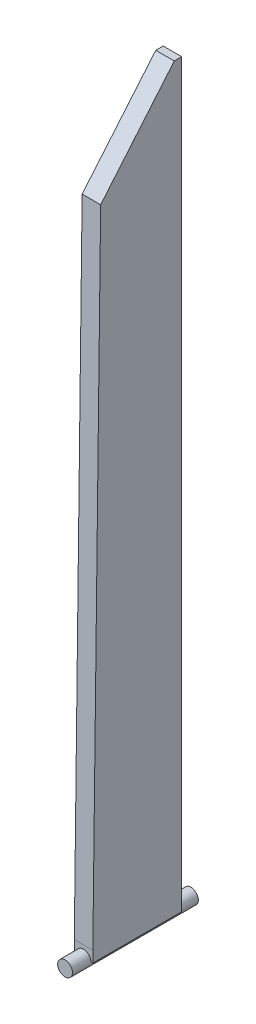
ISO-10303-21;
HEADER;
FILE_DESCRIPTION(('STEP AP214'),'2;1');
FILE_NAME('part.step','',(''),(''),'','','');
FILE_SCHEMA(('AUTOMOTIVE_DESIGN { 1 0 10303 214 1 1 1 1 }'));
ENDSEC;
DATA;
#1=APPLICATION_CONTEXT('core data for automotive mechanical design processes');
#2=APPLICATION_PROTOCOL_DEFINITION('international standard','automotive_design',2000,#1);
#3=PRODUCT_CONTEXT('',#1,'mechanical');
#4=PRODUCT('Part','Part','',(#3));
#5=PRODUCT_RELATED_PRODUCT_CATEGORY('part','',(#4));
#6=PRODUCT_DEFINITION_FORMATION('','',#4);
#7=PRODUCT_DEFINITION_CONTEXT('part definition',#1,'design');
#8=PRODUCT_DEFINITION('design','',#6,#7);
#9=PRODUCT_DEFINITION_SHAPE('','',#8);
#10=(LENGTH_UNIT() NAMED_UNIT(*) SI_UNIT(.MILLI.,.METRE.));
#11=(NAMED_UNIT(*) PLANE_ANGLE_UNIT() SI_UNIT($,.RADIAN.));
#12=(NAMED_UNIT(*) SI_UNIT($,.STERADIAN.) SOLID_ANGLE_UNIT());
#13=UNCERTAINTY_MEASURE_WITH_UNIT(LENGTH_MEASURE(1.E-05),#10,'distance_accuracy_value','');
#14=(GEOMETRIC_REPRESENTATION_CONTEXT(3) GLOBAL_UNCERTAINTY_ASSIGNED_CONTEXT((#13)) GLOBAL_UNIT_ASSIGNED_CONTEXT((#10,
#11,#12)) REPRESENTATION_CONTEXT('',''));
#15=CARTESIAN_POINT('',(0.,0.,0.));
#16=DIRECTION('',(0.,0.,1.));
#17=DIRECTION('',(1.,0.,0.));
#18=AXIS2_PLACEMENT_3D('',#15,#16,#17);
#19=CARTESIAN_POINT('',(-0.25,0.,2.4));
#20=DIRECTION('',(0.,1.,0.));
#21=DIRECTION('',(-1.,0.,0.));
#22=AXIS2_PLACEMENT_3D('',#19,#20,#21);
#23=PLANE('',#22);
#24=DIRECTION('',(1.,0.,0.));
#25=VECTOR('',#24,1.);
#26=CARTESIAN_POINT('',(-0.25,0.,0.));
#27=LINE('',#26,#25);
#28=CARTESIAN_POINT('',(-0.25,0.,0.));
#29=VERTEX_POINT('',#28);
#30=CARTESIAN_POINT('',(-0.2,0.,0.));
#31=VERTEX_POINT('',#30);
#32=EDGE_CURVE('E140',#29,#31,#27,.T.);
#33=ORIENTED_EDGE('',*,*,#32,.T.);
#34=DIRECTION('',(0.,0.,1.));
#35=VECTOR('',#34,1.);
#36=CARTESIAN_POINT('',(-0.2,0.,-0.5));
#37=LINE('',#36,#35);
#38=CARTESIAN_POINT('',(-0.2,0.,2.4));
#39=VERTEX_POINT('',#38);
#40=EDGE_CURVE('E147',#31,#39,#37,.T.);
#41=ORIENTED_EDGE('',*,*,#40,.T.);
#42=DIRECTION('',(1.,0.,0.));
#43=VECTOR('',#42,1.);
#44=CARTESIAN_POINT('',(-0.25,0.,2.4));
#45=LINE('',#44,#43);
#46=CARTESIAN_POINT('',(-0.25,0.,2.4));
#47=VERTEX_POINT('',#46);
#48=EDGE_CURVE('E129',#47,#39,#45,.T.);
#49=ORIENTED_EDGE('',*,*,#48,.F.);
#50=DIRECTION('',(0.,0.,-1.));
#51=VECTOR('',#50,1.);
#52=CARTESIAN_POINT('',(-0.25,0.,2.4));
#53=LINE('',#52,#51);
#54=EDGE_CURVE('E43',#47,#29,#53,.T.);
#55=ORIENTED_EDGE('',*,*,#54,.T.);
#56=EDGE_LOOP('',(#33,#41,#49,#55));
#57=FACE_BOUND('',#56,.T.);
#58=ADVANCED_FACE('F35',(#57),#23,.F.);
#59=CARTESIAN_POINT('',(-0.25,0.,2.4));
#60=DIRECTION('',(1.,0.,0.));
#61=DIRECTION('',(0.,1.,0.));
#62=AXIS2_PLACEMENT_3D('',#59,#60,#61);
#63=PLANE('',#62);
#64=DIRECTION('',(0.,-0.999925369660452,0.0122170008352401));
#65=VECTOR('',#64,1.);
#66=CARTESIAN_POINT('',(-0.250000000000002,17.6304868318131,2.18825762549532));
#67=LINE('',#66,#65);
#68=CARTESIAN_POINT('',(-0.250000000000002,17.6304868318131,2.18825762549532));
#69=VERTEX_POINT('',#68);
#70=CARTESIAN_POINT('',(-0.25,0.3,2.4));
#71=VERTEX_POINT('',#70);
#72=EDGE_CURVE('E50',#69,#71,#67,.T.);
#73=ORIENTED_EDGE('',*,*,#72,.F.);
#74=DIRECTION('',(0.,-0.766044443118975,0.642787609686543));
#75=VECTOR('',#74,1.);
#76=CARTESIAN_POINT('',(-0.250000000000002,20.,0.2));
#77=LINE('',#76,#75);
#78=CARTESIAN_POINT('',(-0.250000000000002,20.,0.2));
#79=VERTEX_POINT('',#78);
#80=EDGE_CURVE('E104',#79,#69,#77,.T.);
#81=ORIENTED_EDGE('',*,*,#80,.F.);
#82=DIRECTION('',(0.,0.,-1.));
#83=VECTOR('',#82,1.);
#84=CARTESIAN_POINT('',(-0.250000000000002,20.,2.4));
#85=LINE('',#84,#83);
#86=CARTESIAN_POINT('',(-0.250000000000002,20.,0.));
#87=VERTEX_POINT('',#86);
#88=EDGE_CURVE('E114',#79,#87,#85,.T.);
#89=ORIENTED_EDGE('',*,*,#88,.T.);
#90=DIRECTION('',(0.,-1.,0.));
#91=VECTOR('',#90,1.);
#92=CARTESIAN_POINT('',(-0.25,0.,0.));
#93=LINE('',#92,#91);
#94=EDGE_CURVE('E142',#87,#29,#93,.T.);
#95=ORIENTED_EDGE('',*,*,#94,.T.);
#96=ORIENTED_EDGE('',*,*,#54,.F.);
#97=DIRECTION('',(0.,-1.,0.));
#98=VECTOR('',#97,1.);
#99=CARTESIAN_POINT('',(-0.25,0.,2.4));
#100=LINE('',#99,#98);
#101=EDGE_CURVE('E154',#71,#47,#100,.T.);
#102=ORIENTED_EDGE('',*,*,#101,.F.);
#103=EDGE_LOOP('',(#73,#81,#89,#95,#96,#102));
#104=FACE_BOUND('',#103,.T.);
#105=ADVANCED_FACE('F37',(#104),#63,.F.);
#106=CARTESIAN_POINT('',(0.2,0.,2.4));
#107=VERTEX_POINT('',#106);
#108=CARTESIAN_POINT('',(0.25,0.,2.4));
#109=VERTEX_POINT('',#108);
#110=EDGE_CURVE('E155',#107,#109,#45,.T.);
#111=ORIENTED_EDGE('',*,*,#110,.F.);
#112=DIRECTION('',(0.,0.,1.));
#113=VECTOR('',#112,1.);
#114=CARTESIAN_POINT('',(0.2,0.,-0.5));
#115=LINE('',#114,#113);
#116=CARTESIAN_POINT('',(0.2,0.,0.));
#117=VERTEX_POINT('',#116);
#118=EDGE_CURVE('E163',#107,#117,#115,.F.);
#119=ORIENTED_EDGE('',*,*,#118,.T.);
#120=CARTESIAN_POINT('',(0.25,0.,0.));
#121=VERTEX_POINT('',#120);
#122=EDGE_CURVE('E144',#117,#121,#27,.T.);
#123=ORIENTED_EDGE('',*,*,#122,.T.);
#124=DIRECTION('',(0.,0.,-1.));
#125=VECTOR('',#124,1.);
#126=CARTESIAN_POINT('',(0.25,0.,2.4));
#127=LINE('',#126,#125);
#128=EDGE_CURVE('E126',#109,#121,#127,.T.);
#129=ORIENTED_EDGE('',*,*,#128,.F.);
#130=EDGE_LOOP('',(#111,#119,#123,#129));
#131=FACE_BOUND('',#130,.T.);
#132=ADVANCED_FACE('F184',(#131),#23,.F.);
#133=CARTESIAN_POINT('',(0.25,0.,2.4));
#134=DIRECTION('',(-1.,0.,0.));
#135=DIRECTION('',(0.,-1.,0.));
#136=AXIS2_PLACEMENT_3D('',#133,#134,#135);
#137=PLANE('',#136);
#138=DIRECTION('',(0.,0.,-1.));
#139=VECTOR('',#138,1.);
#140=CARTESIAN_POINT('',(0.25,20.,2.4));
#141=LINE('',#140,#139);
#142=CARTESIAN_POINT('',(0.25,20.,0.2));
#143=VERTEX_POINT('',#142);
#144=CARTESIAN_POINT('',(0.25,20.,0.));
#145=VERTEX_POINT('',#144);
#146=EDGE_CURVE('E123',#143,#145,#141,.T.);
#147=ORIENTED_EDGE('',*,*,#146,.F.);
#148=DIRECTION('',(0.,0.766044443118975,-0.642787609686543));
#149=VECTOR('',#148,1.);
#150=CARTESIAN_POINT('',(0.25,20.,0.2));
#151=LINE('',#150,#149);
#152=CARTESIAN_POINT('',(0.25,17.6304868318131,2.18825762549532));
#153=VERTEX_POINT('',#152);
#154=EDGE_CURVE('E106',#153,#143,#151,.T.);
#155=ORIENTED_EDGE('',*,*,#154,.F.);
#156=DIRECTION('',(0.,0.999925369660452,-0.0122170008352401));
#157=VECTOR('',#156,1.);
#158=CARTESIAN_POINT('',(0.25,17.6304868318131,2.18825762549532));
#159=LINE('',#158,#157);
#160=CARTESIAN_POINT('',(0.25,0.3,2.4));
#161=VERTEX_POINT('',#160);
#162=EDGE_CURVE('E117',#161,#153,#159,.T.);
#163=ORIENTED_EDGE('',*,*,#162,.F.);
#164=DIRECTION('',(0.,1.,0.));
#165=VECTOR('',#164,1.);
#166=CARTESIAN_POINT('',(0.25,0.,2.4));
#167=LINE('',#166,#165);
#168=EDGE_CURVE('E124',#109,#161,#167,.T.);
#169=ORIENTED_EDGE('',*,*,#168,.F.);
#170=ORIENTED_EDGE('',*,*,#128,.T.);
#171=DIRECTION('',(0.,1.,0.));
#172=VECTOR('',#171,1.);
#173=CARTESIAN_POINT('',(0.25,0.,0.));
#174=LINE('',#173,#172);
#175=EDGE_CURVE('E150',#121,#145,#174,.T.);
#176=ORIENTED_EDGE('',*,*,#175,.T.);
#177=EDGE_LOOP('',(#147,#155,#163,#169,#170,#176));
#178=FACE_BOUND('',#177,.T.);
#179=ADVANCED_FACE('F182',(#178),#137,.F.);
#180=CARTESIAN_POINT('',(-0.250000000000002,20.,2.4));
#181=DIRECTION('',(0.,-1.,0.));
#182=DIRECTION('',(0.,0.,-1.));
#183=AXIS2_PLACEMENT_3D('',#180,#181,#182);
#184=PLANE('',#183);
#185=ORIENTED_EDGE('',*,*,#88,.F.);
#186=DIRECTION('',(-1.,0.,0.));
#187=VECTOR('',#186,1.);
#188=CARTESIAN_POINT('',(-0.251000000000003,20.,0.2));
#189=LINE('',#188,#187);
#190=EDGE_CURVE('E101',#143,#79,#189,.T.);
#191=ORIENTED_EDGE('',*,*,#190,.F.);
#192=ORIENTED_EDGE('',*,*,#146,.T.);
#193=DIRECTION('',(-1.,0.,0.));
#194=VECTOR('',#193,1.);
#195=CARTESIAN_POINT('',(-0.250000000000002,20.,0.));
#196=LINE('',#195,#194);
#197=EDGE_CURVE('E121',#145,#87,#196,.T.);
#198=ORIENTED_EDGE('',*,*,#197,.T.);
#199=EDGE_LOOP('',(#185,#191,#192,#198));
#200=FACE_BOUND('',#199,.T.);
#201=ADVANCED_FACE('F119',(#200),#184,.F.);
#202=CARTESIAN_POINT('',(0.,0.,2.4));
#203=DIRECTION('',(0.,0.,-1.));
#204=DIRECTION('',(-1.,0.,0.));
#205=AXIS2_PLACEMENT_3D('',#202,#203,#204);
#206=PLANE('',#205);
#207=ORIENTED_EDGE('',*,*,#168,.T.);
#208=DIRECTION('',(1.,0.,0.));
#209=VECTOR('',#208,1.);
#210=CARTESIAN_POINT('',(-0.251000000000002,0.3,2.4));
#211=LINE('',#210,#209);
#212=EDGE_CURVE('E110',#71,#161,#211,.T.);
#213=ORIENTED_EDGE('',*,*,#212,.F.);
#214=ORIENTED_EDGE('',*,*,#101,.T.);
#215=ORIENTED_EDGE('',*,*,#48,.T.);
#216=CARTESIAN_POINT('',(0.,0.,2.4));
#217=DIRECTION('',(0.,0.,-1.));
#218=DIRECTION('',(-1.,0.,0.));
#219=AXIS2_PLACEMENT_3D('',#216,#217,#218);
#220=CIRCLE('',#219,0.2);
#221=EDGE_CURVE('E58',#39,#107,#220,.T.);
#222=ORIENTED_EDGE('',*,*,#221,.T.);
#223=ORIENTED_EDGE('',*,*,#110,.T.);
#224=EDGE_LOOP('',(#207,#213,#214,#215,#222,#223));
#225=FACE_BOUND('',#224,.T.);
#226=ADVANCED_FACE('F158',(#225),#206,.F.);
#227=CARTESIAN_POINT('',(0.,0.,0.));
#228=DIRECTION('',(0.,0.,-1.));
#229=DIRECTION('',(-1.,0.,0.));
#230=AXIS2_PLACEMENT_3D('',#227,#228,#229);
#231=PLANE('',#230);
#232=CARTESIAN_POINT('',(0.,0.,0.));
#233=DIRECTION('',(0.,0.,-1.));
#234=DIRECTION('',(-1.,0.,0.));
#235=AXIS2_PLACEMENT_3D('',#232,#233,#234);
#236=CIRCLE('',#235,0.2);
#237=EDGE_CURVE('E11',#31,#117,#236,.T.);
#238=ORIENTED_EDGE('',*,*,#237,.F.);
#239=ORIENTED_EDGE('',*,*,#32,.F.);
#240=ORIENTED_EDGE('',*,*,#94,.F.);
#241=ORIENTED_EDGE('',*,*,#197,.F.);
#242=ORIENTED_EDGE('',*,*,#175,.F.);
#243=ORIENTED_EDGE('',*,*,#122,.F.);
#244=EDGE_LOOP('',(#238,#239,#240,#241,#242,#243));
#245=FACE_BOUND('',#244,.T.);
#246=ADVANCED_FACE('F185',(#245),#231,.T.);
#247=CARTESIAN_POINT('',(0.,0.,-0.5));
#248=DIRECTION('',(0.,0.,1.));
#249=DIRECTION('',(1.,0.,0.));
#250=AXIS2_PLACEMENT_3D('',#247,#248,#249);
#251=CYLINDRICAL_SURFACE('',#250,0.2);
#252=CARTESIAN_POINT('',(0.,0.,2.9));
#253=DIRECTION('',(0.,0.,1.));
#254=DIRECTION('',(1.,0.,0.));
#255=AXIS2_PLACEMENT_3D('',#252,#253,#254);
#256=CIRCLE('',#255,0.2);
#257=CARTESIAN_POINT('',(0.2,0.,2.9));
#258=VERTEX_POINT('',#257);
#259=EDGE_CURVE('E168',#258,#258,#256,.T.);
#260=ORIENTED_EDGE('',*,*,#259,.F.);
#261=EDGE_LOOP('',(#260));
#262=FACE_BOUND('',#261,.T.);
#263=CARTESIAN_POINT('',(0.,0.,-0.5));
#264=DIRECTION('',(0.,0.,1.));
#265=DIRECTION('',(1.,0.,0.));
#266=AXIS2_PLACEMENT_3D('',#263,#264,#265);
#267=CIRCLE('',#266,0.2);
#268=CARTESIAN_POINT('',(0.2,0.,-0.5));
#269=VERTEX_POINT('',#268);
#270=EDGE_CURVE('E165',#269,#269,#267,.T.);
#271=ORIENTED_EDGE('',*,*,#270,.T.);
#272=EDGE_LOOP('',(#271));
#273=FACE_BOUND('',#272,.T.);
#274=ORIENTED_EDGE('',*,*,#221,.F.);
#275=ORIENTED_EDGE('',*,*,#40,.F.);
#276=ORIENTED_EDGE('',*,*,#237,.T.);
#277=ORIENTED_EDGE('',*,*,#118,.F.);
#278=EDGE_LOOP('',(#274,#275,#276,#277));
#279=FACE_BOUND('',#278,.T.);
#280=ADVANCED_FACE('F161',(#262,#273,#279),#251,.T.);
#281=CARTESIAN_POINT('',(0.,0.,-0.5));
#282=DIRECTION('',(0.,0.,1.));
#283=DIRECTION('',(1.,0.,0.));
#284=AXIS2_PLACEMENT_3D('',#281,#282,#283);
#285=PLANE('',#284);
#286=ORIENTED_EDGE('',*,*,#270,.F.);
#287=EDGE_LOOP('',(#286));
#288=FACE_BOUND('',#287,.T.);
#289=ADVANCED_FACE('F192',(#288),#285,.F.);
#290=CARTESIAN_POINT('',(0.,0.,2.9));
#291=DIRECTION('',(0.,0.,1.));
#292=DIRECTION('',(1.,0.,0.));
#293=AXIS2_PLACEMENT_3D('',#290,#291,#292);
#294=PLANE('',#293);
#295=ORIENTED_EDGE('',*,*,#259,.T.);
#296=EDGE_LOOP('',(#295));
#297=FACE_BOUND('',#296,.T.);
#298=ADVANCED_FACE('F225',(#297),#294,.T.);
#299=CARTESIAN_POINT('',(-0.251000000000003,20.,0.2));
#300=DIRECTION('',(0.,-0.642787609686543,-0.766044443118975));
#301=DIRECTION('',(0.,0.766044443118975,-0.642787609686543));
#302=AXIS2_PLACEMENT_3D('',#299,#300,#301);
#303=PLANE('',#302);
#304=ORIENTED_EDGE('',*,*,#80,.T.);
#305=DIRECTION('',(1.,0.,0.));
#306=VECTOR('',#305,1.);
#307=CARTESIAN_POINT('',(-0.251000000000003,17.6304868318131,2.18825762549532));
#308=LINE('',#307,#306);
#309=EDGE_CURVE('E174',#69,#153,#308,.T.);
#310=ORIENTED_EDGE('',*,*,#309,.T.);
#311=ORIENTED_EDGE('',*,*,#154,.T.);
#312=ORIENTED_EDGE('',*,*,#190,.T.);
#313=EDGE_LOOP('',(#304,#310,#311,#312));
#314=FACE_BOUND('',#313,.T.);
#315=ADVANCED_FACE('F103',(#314),#303,.F.);
#316=CARTESIAN_POINT('',(-0.251000000000003,17.6304868318131,2.18825762549532));
#317=DIRECTION('',(0.,-0.0122170008352401,-0.999925369660452));
#318=DIRECTION('',(0.,0.999925369660452,-0.0122170008352401));
#319=AXIS2_PLACEMENT_3D('',#316,#317,#318);
#320=PLANE('',#319);
#321=ORIENTED_EDGE('',*,*,#72,.T.);
#322=ORIENTED_EDGE('',*,*,#212,.T.);
#323=ORIENTED_EDGE('',*,*,#162,.T.);
#324=ORIENTED_EDGE('',*,*,#309,.F.);
#325=EDGE_LOOP('',(#321,#322,#323,#324));
#326=FACE_BOUND('',#325,.T.);
#327=ADVANCED_FACE('F180',(#326),#320,.F.);
#328=CLOSED_SHELL('',(#58,#105,#132,#179,#201,#226,#246,#280,#289,#298,#315,#327));
#329=MANIFOLD_SOLID_BREP('B2',#328);
#330=ADVANCED_BREP_SHAPE_REPRESENTATION('',(#18,#329),#14);
#331=SHAPE_DEFINITION_REPRESENTATION(#9,#330);
ENDSEC;
END-ISO-10303-21;
